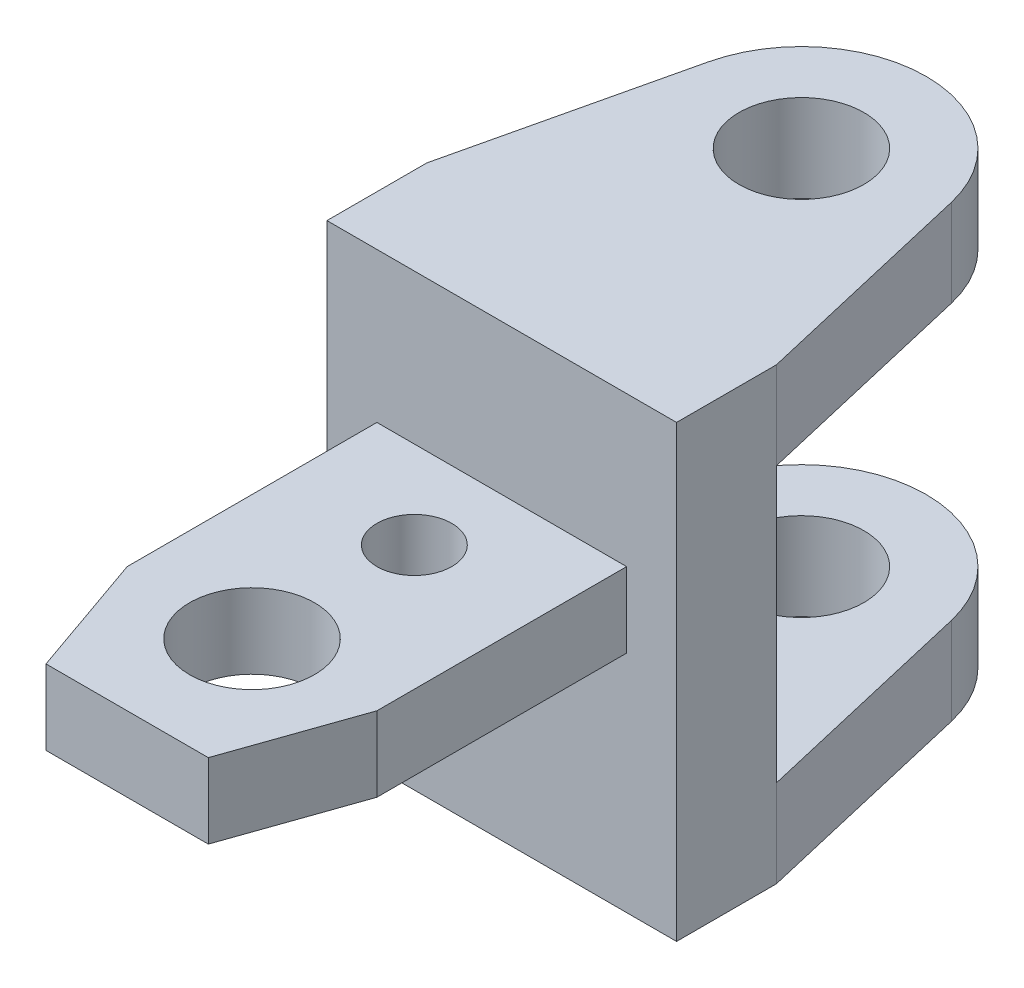
ISO-10303-21;
HEADER;
FILE_DESCRIPTION(('STEP AP214'),'2;1');
FILE_NAME('part.step','',(''),(''),'','','');
FILE_SCHEMA(('AUTOMOTIVE_DESIGN { 1 0 10303 214 1 1 1 1 }'));
ENDSEC;
DATA;
#1=APPLICATION_CONTEXT('core data for automotive mechanical design processes');
#2=APPLICATION_PROTOCOL_DEFINITION('international standard','automotive_design',2000,#1);
#3=PRODUCT_CONTEXT('',#1,'mechanical');
#4=PRODUCT('Part','Part','',(#3));
#5=PRODUCT_RELATED_PRODUCT_CATEGORY('part','',(#4));
#6=PRODUCT_DEFINITION_FORMATION('','',#4);
#7=PRODUCT_DEFINITION_CONTEXT('part definition',#1,'design');
#8=PRODUCT_DEFINITION('design','',#6,#7);
#9=PRODUCT_DEFINITION_SHAPE('','',#8);
#10=(LENGTH_UNIT() NAMED_UNIT(*) SI_UNIT(.MILLI.,.METRE.));
#11=(NAMED_UNIT(*) PLANE_ANGLE_UNIT() SI_UNIT($,.RADIAN.));
#12=(NAMED_UNIT(*) SI_UNIT($,.STERADIAN.) SOLID_ANGLE_UNIT());
#13=UNCERTAINTY_MEASURE_WITH_UNIT(LENGTH_MEASURE(1.E-05),#10,'distance_accuracy_value','');
#14=(GEOMETRIC_REPRESENTATION_CONTEXT(3) GLOBAL_UNCERTAINTY_ASSIGNED_CONTEXT((#13)) GLOBAL_UNIT_ASSIGNED_CONTEXT((#10,
#11,#12)) REPRESENTATION_CONTEXT('',''));
#15=CARTESIAN_POINT('',(0.,0.,0.));
#16=DIRECTION('',(0.,0.,1.));
#17=DIRECTION('',(1.,0.,0.));
#18=AXIS2_PLACEMENT_3D('',#15,#16,#17);
#19=CARTESIAN_POINT('',(0.,0.,-8.));
#20=DIRECTION('',(0.,0.,-1.));
#21=DIRECTION('',(-1.,0.,0.));
#22=AXIS2_PLACEMENT_3D('',#19,#20,#21);
#23=PLANE('',#22);
#24=DIRECTION('',(0.,1.,0.));
#25=VECTOR('',#24,1.);
#26=CARTESIAN_POINT('',(14.,-18.,-8.));
#27=LINE('',#26,#25);
#28=CARTESIAN_POINT('',(14.,-11.,-8.));
#29=VERTEX_POINT('',#28);
#30=CARTESIAN_POINT('',(14.,11.,-8.));
#31=VERTEX_POINT('',#30);
#32=EDGE_CURVE('E246',#29,#31,#27,.T.);
#33=ORIENTED_EDGE('',*,*,#32,.F.);
#34=DIRECTION('',(1.,0.,0.));
#35=VECTOR('',#34,1.);
#36=CARTESIAN_POINT('',(-14.,-11.,-8.));
#37=LINE('',#36,#35);
#38=CARTESIAN_POINT('',(-14.,-11.,-8.));
#39=VERTEX_POINT('',#38);
#40=EDGE_CURVE('E192',#39,#29,#37,.T.);
#41=ORIENTED_EDGE('',*,*,#40,.F.);
#42=DIRECTION('',(0.,-1.,0.));
#43=VECTOR('',#42,1.);
#44=CARTESIAN_POINT('',(-14.,-18.,-8.));
#45=LINE('',#44,#43);
#46=CARTESIAN_POINT('',(-14.,11.,-8.));
#47=VERTEX_POINT('',#46);
#48=EDGE_CURVE('E245',#47,#39,#45,.T.);
#49=ORIENTED_EDGE('',*,*,#48,.F.);
#50=DIRECTION('',(1.,0.,0.));
#51=VECTOR('',#50,1.);
#52=CARTESIAN_POINT('',(-14.,11.,-8.));
#53=LINE('',#52,#51);
#54=EDGE_CURVE('E217',#47,#31,#53,.T.);
#55=ORIENTED_EDGE('',*,*,#54,.T.);
#56=EDGE_LOOP('',(#33,#41,#49,#55));
#57=FACE_BOUND('',#56,.T.);
#58=ADVANCED_FACE('F35',(#57),#23,.T.);
#59=CARTESIAN_POINT('',(14.,-18.,-8.));
#60=DIRECTION('',(1.,0.,0.));
#61=DIRECTION('',(0.,0.,-1.));
#62=AXIS2_PLACEMENT_3D('',#59,#60,#61);
#63=PLANE('',#62);
#64=DIRECTION('',(0.,1.,0.));
#65=VECTOR('',#64,1.);
#66=CARTESIAN_POINT('',(14.,-18.,0.));
#67=LINE('',#66,#65);
#68=CARTESIAN_POINT('',(14.,-18.,0.));
#69=VERTEX_POINT('',#68);
#70=CARTESIAN_POINT('',(14.,18.,0.));
#71=VERTEX_POINT('',#70);
#72=EDGE_CURVE('E237',#69,#71,#67,.T.);
#73=ORIENTED_EDGE('',*,*,#72,.F.);
#74=DIRECTION('',(0.,0.,1.));
#75=VECTOR('',#74,1.);
#76=CARTESIAN_POINT('',(14.,-18.,-8.));
#77=LINE('',#76,#75);
#78=CARTESIAN_POINT('',(14.,-18.,-8.));
#79=VERTEX_POINT('',#78);
#80=EDGE_CURVE('E262',#79,#69,#77,.T.);
#81=ORIENTED_EDGE('',*,*,#80,.F.);
#82=EDGE_CURVE('E242',#79,#29,#27,.T.);
#83=ORIENTED_EDGE('',*,*,#82,.T.);
#84=ORIENTED_EDGE('',*,*,#32,.T.);
#85=DIRECTION('',(0.,1.,0.));
#86=VECTOR('',#85,1.);
#87=CARTESIAN_POINT('',(14.,11.,-8.));
#88=LINE('',#87,#86);
#89=CARTESIAN_POINT('',(14.,18.,-8.));
#90=VERTEX_POINT('',#89);
#91=EDGE_CURVE('E227',#31,#90,#88,.T.);
#92=ORIENTED_EDGE('',*,*,#91,.T.);
#93=DIRECTION('',(0.,0.,1.));
#94=VECTOR('',#93,1.);
#95=CARTESIAN_POINT('',(14.,18.,-8.));
#96=LINE('',#95,#94);
#97=EDGE_CURVE('E250',#90,#71,#96,.T.);
#98=ORIENTED_EDGE('',*,*,#97,.T.);
#99=EDGE_LOOP('',(#73,#81,#83,#84,#92,#98));
#100=FACE_BOUND('',#99,.T.);
#101=ADVANCED_FACE('F310',(#100),#63,.T.);
#102=CARTESIAN_POINT('',(-14.,-18.,-8.));
#103=DIRECTION('',(0.,-1.,0.));
#104=DIRECTION('',(0.,0.,-1.));
#105=AXIS2_PLACEMENT_3D('',#102,#103,#104);
#106=PLANE('',#105);
#107=DIRECTION('',(1.,0.,0.));
#108=VECTOR('',#107,1.);
#109=CARTESIAN_POINT('',(-14.,-18.,0.));
#110=LINE('',#109,#108);
#111=CARTESIAN_POINT('',(-14.,-18.,0.));
#112=VERTEX_POINT('',#111);
#113=EDGE_CURVE('E259',#112,#69,#110,.T.);
#114=ORIENTED_EDGE('',*,*,#113,.F.);
#115=DIRECTION('',(0.,0.,1.));
#116=VECTOR('',#115,1.);
#117=CARTESIAN_POINT('',(-14.,-18.,-8.));
#118=LINE('',#117,#116);
#119=CARTESIAN_POINT('',(-14.,-18.,-8.));
#120=VERTEX_POINT('',#119);
#121=EDGE_CURVE('E265',#120,#112,#118,.T.);
#122=ORIENTED_EDGE('',*,*,#121,.F.);
#123=DIRECTION('',(-0.227131156084319,0.,0.973864178382079));
#124=VECTOR('',#123,1.);
#125=CARTESIAN_POINT('',(-9.73864178382079,-18.,-26.2713115608432));
#126=LINE('',#125,#124);
#127=CARTESIAN_POINT('',(-9.73864178382079,-18.,-26.2713115608432));
#128=VERTEX_POINT('',#127);
#129=EDGE_CURVE('E183',#128,#120,#126,.T.);
#130=ORIENTED_EDGE('',*,*,#129,.F.);
#131=CARTESIAN_POINT('',(0.,-18.,-24.));
#132=DIRECTION('',(0.,1.,0.));
#133=DIRECTION('',(0.,0.,1.));
#134=AXIS2_PLACEMENT_3D('',#131,#132,#133);
#135=CIRCLE('',#134,10.);
#136=CARTESIAN_POINT('',(9.73864178382079,-18.,-26.2713115608432));
#137=VERTEX_POINT('',#136);
#138=EDGE_CURVE('E196',#137,#128,#135,.T.);
#139=ORIENTED_EDGE('',*,*,#138,.F.);
#140=DIRECTION('',(-0.227131156084319,0.,-0.973864178382079));
#141=VECTOR('',#140,1.);
#142=CARTESIAN_POINT('',(14.,-18.,-8.));
#143=LINE('',#142,#141);
#144=EDGE_CURVE('E188',#79,#137,#143,.T.);
#145=ORIENTED_EDGE('',*,*,#144,.F.);
#146=ORIENTED_EDGE('',*,*,#80,.T.);
#147=EDGE_LOOP('',(#114,#122,#130,#139,#145,#146));
#148=FACE_BOUND('',#147,.T.);
#149=CARTESIAN_POINT('',(0.,-18.,-24.));
#150=DIRECTION('',(0.,1.,0.));
#151=DIRECTION('',(0.,0.,1.));
#152=AXIS2_PLACEMENT_3D('',#149,#150,#151);
#153=CIRCLE('',#152,5.);
#154=CARTESIAN_POINT('',(0.,-18.,-19.));
#155=VERTEX_POINT('',#154);
#156=EDGE_CURVE('E172',#155,#155,#153,.T.);
#157=ORIENTED_EDGE('',*,*,#156,.T.);
#158=EDGE_LOOP('',(#157));
#159=FACE_BOUND('',#158,.T.);
#160=ADVANCED_FACE('F316',(#148,#159),#106,.T.);
#161=CARTESIAN_POINT('',(-14.,-18.,-8.));
#162=DIRECTION('',(-1.,0.,0.));
#163=DIRECTION('',(0.,0.,1.));
#164=AXIS2_PLACEMENT_3D('',#161,#162,#163);
#165=PLANE('',#164);
#166=DIRECTION('',(0.,-1.,0.));
#167=VECTOR('',#166,1.);
#168=CARTESIAN_POINT('',(-14.,-18.,0.));
#169=LINE('',#168,#167);
#170=CARTESIAN_POINT('',(-14.,18.,0.));
#171=VERTEX_POINT('',#170);
#172=EDGE_CURVE('E256',#171,#112,#169,.T.);
#173=ORIENTED_EDGE('',*,*,#172,.F.);
#174=DIRECTION('',(0.,0.,1.));
#175=VECTOR('',#174,1.);
#176=CARTESIAN_POINT('',(-14.,18.,-8.));
#177=LINE('',#176,#175);
#178=CARTESIAN_POINT('',(-14.,18.,-8.));
#179=VERTEX_POINT('',#178);
#180=EDGE_CURVE('E267',#179,#171,#177,.T.);
#181=ORIENTED_EDGE('',*,*,#180,.F.);
#182=EDGE_CURVE('E247',#179,#47,#45,.T.);
#183=ORIENTED_EDGE('',*,*,#182,.T.);
#184=ORIENTED_EDGE('',*,*,#48,.T.);
#185=DIRECTION('',(0.,-1.,0.));
#186=VECTOR('',#185,1.);
#187=CARTESIAN_POINT('',(-14.,-11.,-8.));
#188=LINE('',#187,#186);
#189=EDGE_CURVE('E199',#39,#120,#188,.T.);
#190=ORIENTED_EDGE('',*,*,#189,.T.);
#191=ORIENTED_EDGE('',*,*,#121,.T.);
#192=EDGE_LOOP('',(#173,#181,#183,#184,#190,#191));
#193=FACE_BOUND('',#192,.T.);
#194=ADVANCED_FACE('F329',(#193),#165,.T.);
#195=CARTESIAN_POINT('',(-14.,18.,-8.));
#196=DIRECTION('',(0.,1.,0.));
#197=DIRECTION('',(0.,0.,1.));
#198=AXIS2_PLACEMENT_3D('',#195,#196,#197);
#199=PLANE('',#198);
#200=DIRECTION('',(-1.,0.,0.));
#201=VECTOR('',#200,1.);
#202=CARTESIAN_POINT('',(-14.,18.,0.));
#203=LINE('',#202,#201);
#204=EDGE_CURVE('E253',#71,#171,#203,.T.);
#205=ORIENTED_EDGE('',*,*,#204,.F.);
#206=ORIENTED_EDGE('',*,*,#97,.F.);
#207=DIRECTION('',(-0.227131156084319,0.,-0.973864178382079));
#208=VECTOR('',#207,1.);
#209=CARTESIAN_POINT('',(14.,18.,-8.));
#210=LINE('',#209,#208);
#211=CARTESIAN_POINT('',(9.73864178382079,18.,-26.2713115608432));
#212=VERTEX_POINT('',#211);
#213=EDGE_CURVE('E230',#90,#212,#210,.T.);
#214=ORIENTED_EDGE('',*,*,#213,.T.);
#215=CARTESIAN_POINT('',(0.,18.,-24.));
#216=DIRECTION('',(0.,1.,0.));
#217=DIRECTION('',(0.,0.,1.));
#218=AXIS2_PLACEMENT_3D('',#215,#216,#217);
#219=CIRCLE('',#218,10.);
#220=CARTESIAN_POINT('',(-9.73864178382079,18.,-26.2713115608432));
#221=VERTEX_POINT('',#220);
#222=EDGE_CURVE('E218',#212,#221,#219,.T.);
#223=ORIENTED_EDGE('',*,*,#222,.T.);
#224=DIRECTION('',(-0.227131156084319,0.,0.973864178382079));
#225=VECTOR('',#224,1.);
#226=CARTESIAN_POINT('',(-9.73864178382079,18.,-26.2713115608432));
#227=LINE('',#226,#225);
#228=EDGE_CURVE('E211',#221,#179,#227,.T.);
#229=ORIENTED_EDGE('',*,*,#228,.T.);
#230=ORIENTED_EDGE('',*,*,#180,.T.);
#231=EDGE_LOOP('',(#205,#206,#214,#223,#229,#230));
#232=FACE_BOUND('',#231,.T.);
#233=CARTESIAN_POINT('',(0.,18.,-24.));
#234=DIRECTION('',(0.,1.,0.));
#235=DIRECTION('',(0.,0.,1.));
#236=AXIS2_PLACEMENT_3D('',#233,#234,#235);
#237=CIRCLE('',#236,5.);
#238=CARTESIAN_POINT('',(0.,18.,-19.));
#239=VERTEX_POINT('',#238);
#240=EDGE_CURVE('E202',#239,#239,#237,.T.);
#241=ORIENTED_EDGE('',*,*,#240,.F.);
#242=EDGE_LOOP('',(#241));
#243=FACE_BOUND('',#242,.T.);
#244=ADVANCED_FACE('F326',(#232,#243),#199,.T.);
#245=CARTESIAN_POINT('',(0.,0.,0.));
#246=DIRECTION('',(0.,0.,-1.));
#247=DIRECTION('',(-1.,0.,0.));
#248=AXIS2_PLACEMENT_3D('',#245,#246,#247);
#249=PLANE('',#248);
#250=DIRECTION('',(-1.,0.,0.));
#251=VECTOR('',#250,1.);
#252=CARTESIAN_POINT('',(10.,0.,0.));
#253=LINE('',#252,#251);
#254=CARTESIAN_POINT('',(10.,0.,0.));
#255=VERTEX_POINT('',#254);
#256=CARTESIAN_POINT('',(-10.,0.,0.));
#257=VERTEX_POINT('',#256);
#258=EDGE_CURVE('E283',#255,#257,#253,.T.);
#259=ORIENTED_EDGE('',*,*,#258,.T.);
#260=DIRECTION('',(0.,1.,0.));
#261=VECTOR('',#260,1.);
#262=CARTESIAN_POINT('',(-10.,0.,0.));
#263=LINE('',#262,#261);
#264=CARTESIAN_POINT('',(-10.,6.,0.));
#265=VERTEX_POINT('',#264);
#266=EDGE_CURVE('E171',#257,#265,#263,.T.);
#267=ORIENTED_EDGE('',*,*,#266,.T.);
#268=DIRECTION('',(-1.,0.,0.));
#269=VECTOR('',#268,1.);
#270=CARTESIAN_POINT('',(10.,6.,0.));
#271=LINE('',#270,#269);
#272=CARTESIAN_POINT('',(10.,6.,0.));
#273=VERTEX_POINT('',#272);
#274=EDGE_CURVE('E152',#273,#265,#271,.T.);
#275=ORIENTED_EDGE('',*,*,#274,.F.);
#276=DIRECTION('',(0.,1.,0.));
#277=VECTOR('',#276,1.);
#278=CARTESIAN_POINT('',(10.,0.,0.));
#279=LINE('',#278,#277);
#280=EDGE_CURVE('E159',#255,#273,#279,.T.);
#281=ORIENTED_EDGE('',*,*,#280,.F.);
#282=EDGE_LOOP('',(#259,#267,#275,#281));
#283=FACE_BOUND('',#282,.T.);
#284=ORIENTED_EDGE('',*,*,#72,.T.);
#285=ORIENTED_EDGE('',*,*,#204,.T.);
#286=ORIENTED_EDGE('',*,*,#172,.T.);
#287=ORIENTED_EDGE('',*,*,#113,.T.);
#288=EDGE_LOOP('',(#284,#285,#286,#287));
#289=FACE_BOUND('',#288,.T.);
#290=ADVANCED_FACE('F168',(#283,#289),#249,.F.);
#291=CARTESIAN_POINT('',(-9.73864178382079,11.,-26.2713115608432));
#292=DIRECTION('',(-0.973864178382079,0.,-0.227131156084319));
#293=DIRECTION('',(-0.227131156084319,0.,0.973864178382079));
#294=AXIS2_PLACEMENT_3D('',#291,#292,#293);
#295=PLANE('',#294);
#296=ORIENTED_EDGE('',*,*,#228,.F.);
#297=DIRECTION('',(0.,1.,0.));
#298=VECTOR('',#297,1.);
#299=CARTESIAN_POINT('',(-9.73864178382079,11.,-26.2713115608432));
#300=LINE('',#299,#298);
#301=CARTESIAN_POINT('',(-9.73864178382079,11.,-26.2713115608432));
#302=VERTEX_POINT('',#301);
#303=EDGE_CURVE('E235',#302,#221,#300,.T.);
#304=ORIENTED_EDGE('',*,*,#303,.F.);
#305=DIRECTION('',(-0.227131156084319,0.,0.973864178382079));
#306=VECTOR('',#305,1.);
#307=CARTESIAN_POINT('',(-9.73864178382079,11.,-26.2713115608432));
#308=LINE('',#307,#306);
#309=EDGE_CURVE('E214',#302,#47,#308,.T.);
#310=ORIENTED_EDGE('',*,*,#309,.T.);
#311=ORIENTED_EDGE('',*,*,#182,.F.);
#312=EDGE_LOOP('',(#296,#304,#310,#311));
#313=FACE_BOUND('',#312,.T.);
#314=ADVANCED_FACE('F322',(#313),#295,.T.);
#315=CARTESIAN_POINT('',(0.,11.,-24.));
#316=DIRECTION('',(0.,1.,0.));
#317=DIRECTION('',(0.,0.,1.));
#318=AXIS2_PLACEMENT_3D('',#315,#316,#317);
#319=CYLINDRICAL_SURFACE('',#318,10.);
#320=ORIENTED_EDGE('',*,*,#222,.F.);
#321=DIRECTION('',(0.,1.,0.));
#322=VECTOR('',#321,1.);
#323=CARTESIAN_POINT('',(9.73864178382079,11.,-26.2713115608432));
#324=LINE('',#323,#322);
#325=CARTESIAN_POINT('',(9.73864178382079,11.,-26.2713115608432));
#326=VERTEX_POINT('',#325);
#327=EDGE_CURVE('E238',#326,#212,#324,.T.);
#328=ORIENTED_EDGE('',*,*,#327,.F.);
#329=CARTESIAN_POINT('',(0.,11.,-24.));
#330=DIRECTION('',(0.,1.,0.));
#331=DIRECTION('',(0.,0.,1.));
#332=AXIS2_PLACEMENT_3D('',#329,#330,#331);
#333=CIRCLE('',#332,10.);
#334=EDGE_CURVE('E224',#326,#302,#333,.T.);
#335=ORIENTED_EDGE('',*,*,#334,.T.);
#336=ORIENTED_EDGE('',*,*,#303,.T.);
#337=EDGE_LOOP('',(#320,#328,#335,#336));
#338=FACE_BOUND('',#337,.T.);
#339=ADVANCED_FACE('F368',(#338),#319,.T.);
#340=CARTESIAN_POINT('',(14.,11.,-8.));
#341=DIRECTION('',(0.973864178382078,0.,-0.227131156084319));
#342=DIRECTION('',(-0.227131156084319,0.,-0.973864178382079));
#343=AXIS2_PLACEMENT_3D('',#340,#341,#342);
#344=PLANE('',#343);
#345=ORIENTED_EDGE('',*,*,#213,.F.);
#346=ORIENTED_EDGE('',*,*,#91,.F.);
#347=DIRECTION('',(-0.227131156084319,0.,-0.973864178382079));
#348=VECTOR('',#347,1.);
#349=CARTESIAN_POINT('',(14.,11.,-8.));
#350=LINE('',#349,#348);
#351=EDGE_CURVE('E221',#31,#326,#350,.T.);
#352=ORIENTED_EDGE('',*,*,#351,.T.);
#353=ORIENTED_EDGE('',*,*,#327,.T.);
#354=EDGE_LOOP('',(#345,#346,#352,#353));
#355=FACE_BOUND('',#354,.T.);
#356=ADVANCED_FACE('F361',(#355),#344,.T.);
#357=CARTESIAN_POINT('',(0.,11.,-24.));
#358=DIRECTION('',(0.,1.,0.));
#359=DIRECTION('',(0.,0.,1.));
#360=AXIS2_PLACEMENT_3D('',#357,#358,#359);
#361=PLANE('',#360);
#362=CARTESIAN_POINT('',(0.,11.,-24.));
#363=DIRECTION('',(0.,1.,0.));
#364=DIRECTION('',(0.,0.,1.));
#365=AXIS2_PLACEMENT_3D('',#362,#363,#364);
#366=CIRCLE('',#365,5.);
#367=CARTESIAN_POINT('',(0.,11.,-19.));
#368=VERTEX_POINT('',#367);
#369=EDGE_CURVE('E208',#368,#368,#366,.T.);
#370=ORIENTED_EDGE('',*,*,#369,.T.);
#371=EDGE_LOOP('',(#370));
#372=FACE_BOUND('',#371,.T.);
#373=ORIENTED_EDGE('',*,*,#309,.F.);
#374=ORIENTED_EDGE('',*,*,#334,.F.);
#375=ORIENTED_EDGE('',*,*,#351,.F.);
#376=ORIENTED_EDGE('',*,*,#54,.F.);
#377=EDGE_LOOP('',(#373,#374,#375,#376));
#378=FACE_BOUND('',#377,.T.);
#379=ADVANCED_FACE('F351',(#372,#378),#361,.F.);
#380=CARTESIAN_POINT('',(0.,11.,-24.));
#381=DIRECTION('',(0.,1.,0.));
#382=DIRECTION('',(0.,0.,1.));
#383=AXIS2_PLACEMENT_3D('',#380,#381,#382);
#384=CYLINDRICAL_SURFACE('',#383,5.);
#385=ORIENTED_EDGE('',*,*,#369,.F.);
#386=EDGE_LOOP('',(#385));
#387=FACE_BOUND('',#386,.T.);
#388=ORIENTED_EDGE('',*,*,#240,.T.);
#389=EDGE_LOOP('',(#388));
#390=FACE_BOUND('',#389,.T.);
#391=ADVANCED_FACE('F348',(#387,#390),#384,.F.);
#392=CARTESIAN_POINT('',(0.,-11.,-24.));
#393=DIRECTION('',(0.,-1.,0.));
#394=DIRECTION('',(0.,0.,1.));
#395=AXIS2_PLACEMENT_3D('',#392,#393,#394);
#396=PLANE('',#395);
#397=DIRECTION('',(-0.227131156084319,0.,0.973864178382079));
#398=VECTOR('',#397,1.);
#399=CARTESIAN_POINT('',(-9.73864178382079,-11.,-26.2713115608432));
#400=LINE('',#399,#398);
#401=CARTESIAN_POINT('',(-9.73864178382079,-11.,-26.2713115608432));
#402=VERTEX_POINT('',#401);
#403=EDGE_CURVE('E185',#402,#39,#400,.T.);
#404=ORIENTED_EDGE('',*,*,#403,.T.);
#405=ORIENTED_EDGE('',*,*,#40,.T.);
#406=DIRECTION('',(-0.227131156084319,0.,-0.973864178382079));
#407=VECTOR('',#406,1.);
#408=CARTESIAN_POINT('',(14.,-11.,-8.));
#409=LINE('',#408,#407);
#410=CARTESIAN_POINT('',(9.73864178382079,-11.,-26.2713115608432));
#411=VERTEX_POINT('',#410);
#412=EDGE_CURVE('E190',#29,#411,#409,.T.);
#413=ORIENTED_EDGE('',*,*,#412,.T.);
#414=CARTESIAN_POINT('',(0.,-11.,-24.));
#415=DIRECTION('',(0.,1.,0.));
#416=DIRECTION('',(0.,0.,1.));
#417=AXIS2_PLACEMENT_3D('',#414,#415,#416);
#418=CIRCLE('',#417,10.);
#419=EDGE_CURVE('E187',#411,#402,#418,.T.);
#420=ORIENTED_EDGE('',*,*,#419,.T.);
#421=EDGE_LOOP('',(#404,#405,#413,#420));
#422=FACE_BOUND('',#421,.T.);
#423=CARTESIAN_POINT('',(0.,-11.,-24.));
#424=DIRECTION('',(0.,1.,0.));
#425=DIRECTION('',(0.,0.,1.));
#426=AXIS2_PLACEMENT_3D('',#423,#424,#425);
#427=CIRCLE('',#426,5.);
#428=CARTESIAN_POINT('',(0.,-11.,-19.));
#429=VERTEX_POINT('',#428);
#430=EDGE_CURVE('E176',#429,#429,#427,.T.);
#431=ORIENTED_EDGE('',*,*,#430,.F.);
#432=EDGE_LOOP('',(#431));
#433=FACE_BOUND('',#432,.T.);
#434=ADVANCED_FACE('F350',(#422,#433),#396,.F.);
#435=CARTESIAN_POINT('',(-9.73864178382079,-11.,-26.2713115608432));
#436=DIRECTION('',(0.973864178382079,0.,0.227131156084319));
#437=DIRECTION('',(0.227131156084319,0.,-0.973864178382079));
#438=AXIS2_PLACEMENT_3D('',#435,#436,#437);
#439=PLANE('',#438);
#440=ORIENTED_EDGE('',*,*,#129,.T.);
#441=ORIENTED_EDGE('',*,*,#189,.F.);
#442=ORIENTED_EDGE('',*,*,#403,.F.);
#443=DIRECTION('',(0.,-1.,0.));
#444=VECTOR('',#443,1.);
#445=CARTESIAN_POINT('',(-9.73864178382079,-11.,-26.2713115608432));
#446=LINE('',#445,#444);
#447=EDGE_CURVE('E194',#402,#128,#446,.T.);
#448=ORIENTED_EDGE('',*,*,#447,.T.);
#449=EDGE_LOOP('',(#440,#441,#442,#448));
#450=FACE_BOUND('',#449,.T.);
#451=ADVANCED_FACE('F358',(#450),#439,.F.);
#452=CARTESIAN_POINT('',(14.,-11.,-8.));
#453=DIRECTION('',(-0.973864178382078,0.,0.227131156084319));
#454=DIRECTION('',(0.227131156084319,0.,0.973864178382079));
#455=AXIS2_PLACEMENT_3D('',#452,#453,#454);
#456=PLANE('',#455);
#457=ORIENTED_EDGE('',*,*,#144,.T.);
#458=DIRECTION('',(0.,-1.,0.));
#459=VECTOR('',#458,1.);
#460=CARTESIAN_POINT('',(9.73864178382079,-11.,-26.2713115608432));
#461=LINE('',#460,#459);
#462=EDGE_CURVE('E203',#411,#137,#461,.T.);
#463=ORIENTED_EDGE('',*,*,#462,.F.);
#464=ORIENTED_EDGE('',*,*,#412,.F.);
#465=ORIENTED_EDGE('',*,*,#82,.F.);
#466=EDGE_LOOP('',(#457,#463,#464,#465));
#467=FACE_BOUND('',#466,.T.);
#468=ADVANCED_FACE('F397',(#467),#456,.F.);
#469=CARTESIAN_POINT('',(0.,-11.,-24.));
#470=DIRECTION('',(0.,-1.,0.));
#471=DIRECTION('',(0.,0.,-1.));
#472=AXIS2_PLACEMENT_3D('',#469,#470,#471);
#473=CYLINDRICAL_SURFACE('',#472,10.);
#474=ORIENTED_EDGE('',*,*,#138,.T.);
#475=ORIENTED_EDGE('',*,*,#447,.F.);
#476=ORIENTED_EDGE('',*,*,#419,.F.);
#477=ORIENTED_EDGE('',*,*,#462,.T.);
#478=EDGE_LOOP('',(#474,#475,#476,#477));
#479=FACE_BOUND('',#478,.T.);
#480=ADVANCED_FACE('F401',(#479),#473,.T.);
#481=CARTESIAN_POINT('',(0.,-11.,-24.));
#482=DIRECTION('',(0.,-1.,0.));
#483=DIRECTION('',(0.,0.,-1.));
#484=AXIS2_PLACEMENT_3D('',#481,#482,#483);
#485=CYLINDRICAL_SURFACE('',#484,5.);
#486=ORIENTED_EDGE('',*,*,#430,.T.);
#487=EDGE_LOOP('',(#486));
#488=FACE_BOUND('',#487,.T.);
#489=ORIENTED_EDGE('',*,*,#156,.F.);
#490=EDGE_LOOP('',(#489));
#491=FACE_BOUND('',#490,.T.);
#492=ADVANCED_FACE('F416',(#488,#491),#485,.F.);
#493=CARTESIAN_POINT('',(10.,6.,30.));
#494=DIRECTION('',(0.,-1.,0.));
#495=DIRECTION('',(0.,0.,-1.));
#496=AXIS2_PLACEMENT_3D('',#493,#494,#495);
#497=PLANE('',#496);
#498=CARTESIAN_POINT('',(0.,6.,7.));
#499=DIRECTION('',(0.,1.,0.));
#500=DIRECTION('',(0.,0.,1.));
#501=AXIS2_PLACEMENT_3D('',#498,#499,#500);
#502=CIRCLE('',#501,3.);
#503=CARTESIAN_POINT('',(0.,6.,10.));
#504=VERTEX_POINT('',#503);
#505=EDGE_CURVE('E436',#504,#504,#502,.T.);
#506=ORIENTED_EDGE('',*,*,#505,.F.);
#507=EDGE_LOOP('',(#506));
#508=FACE_BOUND('',#507,.T.);
#509=CARTESIAN_POINT('',(0.,6.,20.));
#510=DIRECTION('',(0.,1.,0.));
#511=DIRECTION('',(0.,0.,1.));
#512=AXIS2_PLACEMENT_3D('',#509,#510,#511);
#513=CIRCLE('',#512,5.);
#514=CARTESIAN_POINT('',(0.,6.,25.));
#515=VERTEX_POINT('',#514);
#516=EDGE_CURVE('E437',#515,#515,#513,.T.);
#517=ORIENTED_EDGE('',*,*,#516,.F.);
#518=EDGE_LOOP('',(#517));
#519=FACE_BOUND('',#518,.T.);
#520=DIRECTION('',(-1.,0.,0.));
#521=VECTOR('',#520,1.);
#522=CARTESIAN_POINT('',(10.,6.,30.));
#523=LINE('',#522,#521);
#524=CARTESIAN_POINT('',(6.5,6.,30.));
#525=VERTEX_POINT('',#524);
#526=CARTESIAN_POINT('',(-6.49999999999999,6.,30.));
#527=VERTEX_POINT('',#526);
#528=EDGE_CURVE('E173',#525,#527,#523,.T.);
#529=ORIENTED_EDGE('',*,*,#528,.F.);
#530=DIRECTION('',(-0.330350424728104,0.,0.943858356366018));
#531=VECTOR('',#530,1.);
#532=CARTESIAN_POINT('',(10.,6.,19.9999999999999));
#533=LINE('',#532,#531);
#534=CARTESIAN_POINT('',(10.,6.,19.9999999999999));
#535=VERTEX_POINT('',#534);
#536=EDGE_CURVE('E11',#525,#535,#533,.F.);
#537=ORIENTED_EDGE('',*,*,#536,.T.);
#538=DIRECTION('',(0.,0.,1.));
#539=VECTOR('',#538,1.);
#540=CARTESIAN_POINT('',(10.,6.,30.));
#541=LINE('',#540,#539);
#542=EDGE_CURVE('E147',#273,#535,#541,.T.);
#543=ORIENTED_EDGE('',*,*,#542,.F.);
#544=ORIENTED_EDGE('',*,*,#274,.T.);
#545=DIRECTION('',(0.,0.,1.));
#546=VECTOR('',#545,1.);
#547=CARTESIAN_POINT('',(-10.,6.,30.));
#548=LINE('',#547,#546);
#549=CARTESIAN_POINT('',(-10.,6.,19.9999999999999));
#550=VERTEX_POINT('',#549);
#551=EDGE_CURVE('E288',#265,#550,#548,.T.);
#552=ORIENTED_EDGE('',*,*,#551,.T.);
#553=DIRECTION('',(0.330350424728103,0.,0.943858356366019));
#554=VECTOR('',#553,1.);
#555=CARTESIAN_POINT('',(-6.49999999999999,6.,30.));
#556=LINE('',#555,#554);
#557=EDGE_CURVE('E276',#550,#527,#556,.T.);
#558=ORIENTED_EDGE('',*,*,#557,.T.);
#559=EDGE_LOOP('',(#529,#537,#543,#544,#552,#558));
#560=FACE_BOUND('',#559,.T.);
#561=ADVANCED_FACE('F149',(#508,#519,#560),#497,.F.);
#562=CARTESIAN_POINT('',(10.,0.,30.));
#563=DIRECTION('',(0.,0.,-1.));
#564=DIRECTION('',(-1.,0.,0.));
#565=AXIS2_PLACEMENT_3D('',#562,#563,#564);
#566=PLANE('',#565);
#567=DIRECTION('',(-1.,0.,0.));
#568=VECTOR('',#567,1.);
#569=CARTESIAN_POINT('',(10.,0.,30.));
#570=LINE('',#569,#568);
#571=CARTESIAN_POINT('',(6.5,0.,30.));
#572=VERTEX_POINT('',#571);
#573=CARTESIAN_POINT('',(-6.49999999999999,0.,30.));
#574=VERTEX_POINT('',#573);
#575=EDGE_CURVE('E178',#572,#574,#570,.T.);
#576=ORIENTED_EDGE('',*,*,#575,.F.);
#577=DIRECTION('',(0.,1.,0.));
#578=VECTOR('',#577,1.);
#579=CARTESIAN_POINT('',(6.5,0.,30.));
#580=LINE('',#579,#578);
#581=EDGE_CURVE('E44',#572,#525,#580,.T.);
#582=ORIENTED_EDGE('',*,*,#581,.T.);
#583=ORIENTED_EDGE('',*,*,#528,.T.);
#584=DIRECTION('',(0.,-1.,0.));
#585=VECTOR('',#584,1.);
#586=CARTESIAN_POINT('',(-6.49999999999999,0.,30.));
#587=LINE('',#586,#585);
#588=EDGE_CURVE('E264',#527,#574,#587,.T.);
#589=ORIENTED_EDGE('',*,*,#588,.T.);
#590=EDGE_LOOP('',(#576,#582,#583,#589));
#591=FACE_BOUND('',#590,.T.);
#592=ADVANCED_FACE('F298',(#591),#566,.F.);
#593=CARTESIAN_POINT('',(10.,0.,30.));
#594=DIRECTION('',(0.,1.,0.));
#595=DIRECTION('',(0.,0.,1.));
#596=AXIS2_PLACEMENT_3D('',#593,#594,#595);
#597=PLANE('',#596);
#598=CARTESIAN_POINT('',(0.,0.,7.));
#599=DIRECTION('',(0.,1.,0.));
#600=DIRECTION('',(0.,0.,1.));
#601=AXIS2_PLACEMENT_3D('',#598,#599,#600);
#602=CIRCLE('',#601,3.);
#603=CARTESIAN_POINT('',(0.,0.,10.));
#604=VERTEX_POINT('',#603);
#605=EDGE_CURVE('E289',#604,#604,#602,.F.);
#606=ORIENTED_EDGE('',*,*,#605,.F.);
#607=EDGE_LOOP('',(#606));
#608=FACE_BOUND('',#607,.T.);
#609=CARTESIAN_POINT('',(0.,0.,20.));
#610=DIRECTION('',(0.,1.,0.));
#611=DIRECTION('',(0.,0.,1.));
#612=AXIS2_PLACEMENT_3D('',#609,#610,#611);
#613=CIRCLE('',#612,5.);
#614=CARTESIAN_POINT('',(0.,0.,25.));
#615=VERTEX_POINT('',#614);
#616=EDGE_CURVE('E434',#615,#615,#613,.F.);
#617=ORIENTED_EDGE('',*,*,#616,.F.);
#618=EDGE_LOOP('',(#617));
#619=FACE_BOUND('',#618,.T.);
#620=DIRECTION('',(0.,0.,-1.));
#621=VECTOR('',#620,1.);
#622=CARTESIAN_POINT('',(10.,0.,30.));
#623=LINE('',#622,#621);
#624=CARTESIAN_POINT('',(10.,0.,19.9999999999999));
#625=VERTEX_POINT('',#624);
#626=EDGE_CURVE('E158',#625,#255,#623,.T.);
#627=ORIENTED_EDGE('',*,*,#626,.F.);
#628=DIRECTION('',(0.330350424728104,0.,-0.943858356366018));
#629=VECTOR('',#628,1.);
#630=CARTESIAN_POINT('',(10.,0.,19.9999999999999));
#631=LINE('',#630,#629);
#632=EDGE_CURVE('E58',#625,#572,#631,.F.);
#633=ORIENTED_EDGE('',*,*,#632,.T.);
#634=ORIENTED_EDGE('',*,*,#575,.T.);
#635=DIRECTION('',(-0.330350424728103,0.,-0.943858356366019));
#636=VECTOR('',#635,1.);
#637=CARTESIAN_POINT('',(-6.49999999999999,0.,30.));
#638=LINE('',#637,#636);
#639=CARTESIAN_POINT('',(-10.,0.,19.9999999999999));
#640=VERTEX_POINT('',#639);
#641=EDGE_CURVE('E272',#574,#640,#638,.T.);
#642=ORIENTED_EDGE('',*,*,#641,.T.);
#643=DIRECTION('',(0.,0.,-1.));
#644=VECTOR('',#643,1.);
#645=CARTESIAN_POINT('',(-10.,0.,30.));
#646=LINE('',#645,#644);
#647=EDGE_CURVE('E166',#640,#257,#646,.T.);
#648=ORIENTED_EDGE('',*,*,#647,.T.);
#649=ORIENTED_EDGE('',*,*,#258,.F.);
#650=EDGE_LOOP('',(#627,#633,#634,#642,#648,#649));
#651=FACE_BOUND('',#650,.T.);
#652=ADVANCED_FACE('F282',(#608,#619,#651),#597,.F.);
#653=CARTESIAN_POINT('',(10.,0.,0.));
#654=DIRECTION('',(-1.,0.,0.));
#655=DIRECTION('',(0.,0.,1.));
#656=AXIS2_PLACEMENT_3D('',#653,#654,#655);
#657=PLANE('',#656);
#658=ORIENTED_EDGE('',*,*,#542,.T.);
#659=DIRECTION('',(0.,-1.,0.));
#660=VECTOR('',#659,1.);
#661=CARTESIAN_POINT('',(10.,0.,19.9999999999999));
#662=LINE('',#661,#660);
#663=EDGE_CURVE('E279',#535,#625,#662,.T.);
#664=ORIENTED_EDGE('',*,*,#663,.T.);
#665=ORIENTED_EDGE('',*,*,#626,.T.);
#666=ORIENTED_EDGE('',*,*,#280,.T.);
#667=EDGE_LOOP('',(#658,#664,#665,#666));
#668=FACE_BOUND('',#667,.T.);
#669=ADVANCED_FACE('F162',(#668),#657,.F.);
#670=CARTESIAN_POINT('',(-10.,0.,0.));
#671=DIRECTION('',(-1.,0.,0.));
#672=DIRECTION('',(0.,0.,1.));
#673=AXIS2_PLACEMENT_3D('',#670,#671,#672);
#674=PLANE('',#673);
#675=ORIENTED_EDGE('',*,*,#647,.F.);
#676=DIRECTION('',(0.,1.,0.));
#677=VECTOR('',#676,1.);
#678=CARTESIAN_POINT('',(-10.,6.,19.9999999999999));
#679=LINE('',#678,#677);
#680=EDGE_CURVE('E274',#640,#550,#679,.T.);
#681=ORIENTED_EDGE('',*,*,#680,.T.);
#682=ORIENTED_EDGE('',*,*,#551,.F.);
#683=ORIENTED_EDGE('',*,*,#266,.F.);
#684=EDGE_LOOP('',(#675,#681,#682,#683));
#685=FACE_BOUND('',#684,.T.);
#686=ADVANCED_FACE('F300',(#685),#674,.T.);
#687=CARTESIAN_POINT('',(-6.49999999999999,0.,30.));
#688=DIRECTION('',(-0.943858356366018,0.,0.330350424728103));
#689=DIRECTION('',(0.,1.,0.));
#690=AXIS2_PLACEMENT_3D('',#687,#688,#689);
#691=PLANE('',#690);
#692=ORIENTED_EDGE('',*,*,#557,.F.);
#693=ORIENTED_EDGE('',*,*,#680,.F.);
#694=ORIENTED_EDGE('',*,*,#641,.F.);
#695=ORIENTED_EDGE('',*,*,#588,.F.);
#696=EDGE_LOOP('',(#692,#693,#694,#695));
#697=FACE_BOUND('',#696,.T.);
#698=ADVANCED_FACE('F297',(#697),#691,.T.);
#699=CARTESIAN_POINT('',(10.,0.,19.9999999999999));
#700=DIRECTION('',(-0.943858356366018,0.,-0.330350424728104));
#701=DIRECTION('',(0.,-1.,0.));
#702=AXIS2_PLACEMENT_3D('',#699,#700,#701);
#703=PLANE('',#702);
#704=ORIENTED_EDGE('',*,*,#536,.F.);
#705=ORIENTED_EDGE('',*,*,#581,.F.);
#706=ORIENTED_EDGE('',*,*,#632,.F.);
#707=ORIENTED_EDGE('',*,*,#663,.F.);
#708=EDGE_LOOP('',(#704,#705,#706,#707));
#709=FACE_BOUND('',#708,.T.);
#710=ADVANCED_FACE('F38',(#709),#703,.F.);
#711=CARTESIAN_POINT('',(0.,-18.001,20.));
#712=DIRECTION('',(0.,1.,0.));
#713=DIRECTION('',(0.,0.,1.));
#714=AXIS2_PLACEMENT_3D('',#711,#712,#713);
#715=CYLINDRICAL_SURFACE('',#714,5.);
#716=ORIENTED_EDGE('',*,*,#516,.T.);
#717=EDGE_LOOP('',(#716));
#718=FACE_BOUND('',#717,.T.);
#719=ORIENTED_EDGE('',*,*,#616,.T.);
#720=EDGE_LOOP('',(#719));
#721=FACE_BOUND('',#720,.T.);
#722=ADVANCED_FACE('F447',(#718,#721),#715,.F.);
#723=CARTESIAN_POINT('',(0.,-18.001,7.));
#724=DIRECTION('',(0.,1.,0.));
#725=DIRECTION('',(0.,0.,1.));
#726=AXIS2_PLACEMENT_3D('',#723,#724,#725);
#727=CYLINDRICAL_SURFACE('',#726,3.);
#728=ORIENTED_EDGE('',*,*,#505,.T.);
#729=EDGE_LOOP('',(#728));
#730=FACE_BOUND('',#729,.T.);
#731=ORIENTED_EDGE('',*,*,#605,.T.);
#732=EDGE_LOOP('',(#731));
#733=FACE_BOUND('',#732,.T.);
#734=ADVANCED_FACE('F445',(#730,#733),#727,.F.);
#735=CLOSED_SHELL('',(#58,#101,#160,#194,#244,#290,#314,#339,#356,#379,#391,#434,#451,#468,#480,
#492,#561,#592,#652,#669,#686,#698,#710,#722,#734));
#736=MANIFOLD_SOLID_BREP('B2',#735);
#737=ADVANCED_BREP_SHAPE_REPRESENTATION('',(#18,#736),#14);
#738=SHAPE_DEFINITION_REPRESENTATION(#9,#737);
ENDSEC;
END-ISO-10303-21;
